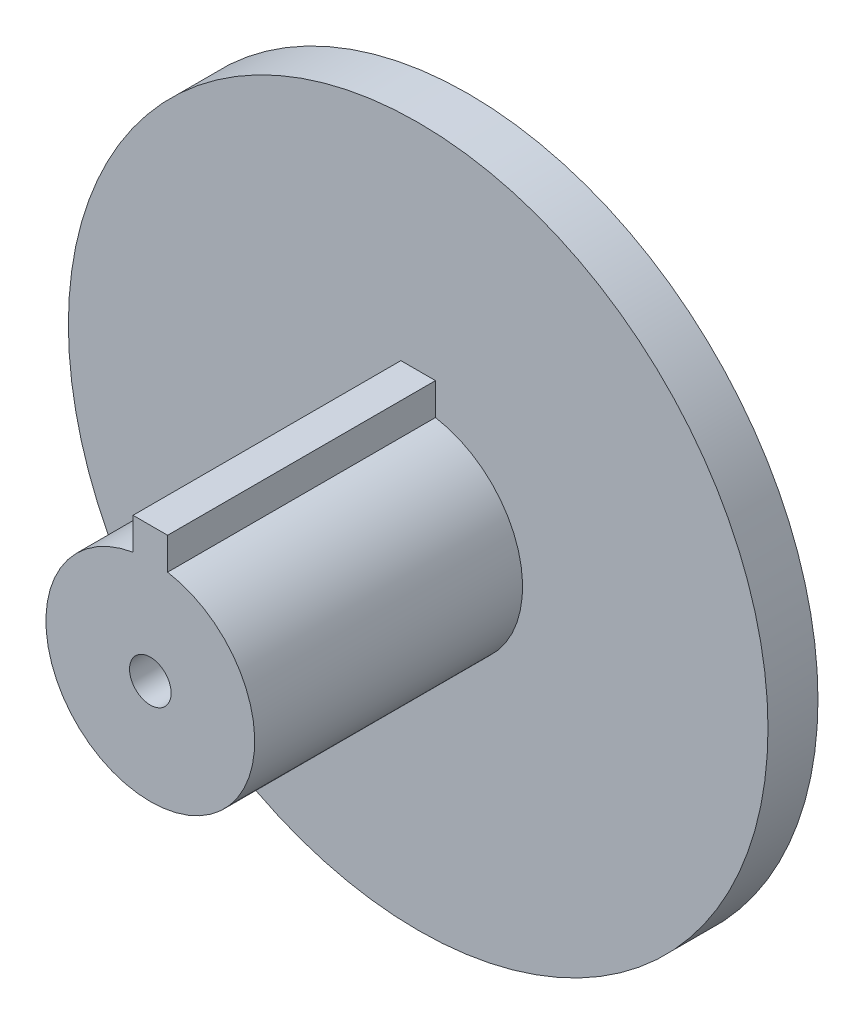
ISO-10303-21;
HEADER;
FILE_DESCRIPTION(('STEP AP214'),'2;1');
FILE_NAME('part.step','',(''),(''),'','','');
FILE_SCHEMA(('AUTOMOTIVE_DESIGN { 1 0 10303 214 1 1 1 1 }'));
ENDSEC;
DATA;
#1=APPLICATION_CONTEXT('core data for automotive mechanical design processes');
#2=APPLICATION_PROTOCOL_DEFINITION('international standard','automotive_design',2000,#1);
#3=PRODUCT_CONTEXT('',#1,'mechanical');
#4=PRODUCT('Part','Part','',(#3));
#5=PRODUCT_RELATED_PRODUCT_CATEGORY('part','',(#4));
#6=PRODUCT_DEFINITION_FORMATION('','',#4);
#7=PRODUCT_DEFINITION_CONTEXT('part definition',#1,'design');
#8=PRODUCT_DEFINITION('design','',#6,#7);
#9=PRODUCT_DEFINITION_SHAPE('','',#8);
#10=(LENGTH_UNIT() NAMED_UNIT(*) SI_UNIT(.MILLI.,.METRE.));
#11=(NAMED_UNIT(*) PLANE_ANGLE_UNIT() SI_UNIT($,.RADIAN.));
#12=(NAMED_UNIT(*) SI_UNIT($,.STERADIAN.) SOLID_ANGLE_UNIT());
#13=UNCERTAINTY_MEASURE_WITH_UNIT(LENGTH_MEASURE(1.E-05),#10,'distance_accuracy_value','');
#14=(GEOMETRIC_REPRESENTATION_CONTEXT(3) GLOBAL_UNCERTAINTY_ASSIGNED_CONTEXT((#13)) GLOBAL_UNIT_ASSIGNED_CONTEXT((#10,
#11,#12)) REPRESENTATION_CONTEXT('',''));
#15=CARTESIAN_POINT('',(0.,0.,0.));
#16=DIRECTION('',(0.,0.,1.));
#17=DIRECTION('',(1.,0.,0.));
#18=AXIS2_PLACEMENT_3D('',#15,#16,#17);
#19=CARTESIAN_POINT('',(0.,0.,6.35));
#20=DIRECTION('',(0.,0.,-1.));
#21=DIRECTION('',(-1.,0.,0.));
#22=AXIS2_PLACEMENT_3D('',#19,#20,#21);
#23=CYLINDRICAL_SURFACE('',#22,44.45);
#24=CARTESIAN_POINT('',(0.,0.,6.35));
#25=DIRECTION('',(0.,0.,1.));
#26=DIRECTION('',(1.,0.,0.));
#27=AXIS2_PLACEMENT_3D('',#24,#25,#26);
#28=CIRCLE('',#27,44.45);
#29=CARTESIAN_POINT('',(44.45,0.,6.35));
#30=VERTEX_POINT('',#29);
#31=EDGE_CURVE('E11',#30,#30,#28,.T.);
#32=ORIENTED_EDGE('',*,*,#31,.F.);
#33=EDGE_LOOP('',(#32));
#34=FACE_BOUND('',#33,.T.);
#35=CARTESIAN_POINT('',(0.,0.,0.));
#36=DIRECTION('',(0.,0.,1.));
#37=DIRECTION('',(1.,0.,0.));
#38=AXIS2_PLACEMENT_3D('',#35,#36,#37);
#39=CIRCLE('',#38,44.45);
#40=CARTESIAN_POINT('',(44.45,0.,0.));
#41=VERTEX_POINT('',#40);
#42=EDGE_CURVE('E44',#41,#41,#39,.T.);
#43=ORIENTED_EDGE('',*,*,#42,.T.);
#44=EDGE_LOOP('',(#43));
#45=FACE_BOUND('',#44,.T.);
#46=ADVANCED_FACE('F41',(#34,#45),#23,.T.);
#47=CARTESIAN_POINT('',(0.,0.,6.35));
#48=DIRECTION('',(0.,0.,1.));
#49=DIRECTION('',(1.,0.,0.));
#50=AXIS2_PLACEMENT_3D('',#47,#48,#49);
#51=PLANE('',#50);
#52=DIRECTION('',(0.,-1.,0.));
#53=VECTOR('',#52,1.);
#54=CARTESIAN_POINT('',(-2.1971,0.,6.35));
#55=LINE('',#54,#53);
#56=CARTESIAN_POINT('',(-2.1971,17.145,6.35));
#57=VERTEX_POINT('',#56);
#58=CARTESIAN_POINT('',(-2.1971,13.081,6.35));
#59=VERTEX_POINT('',#58);
#60=EDGE_CURVE('E56',#57,#59,#55,.T.);
#61=ORIENTED_EDGE('',*,*,#60,.F.);
#62=DIRECTION('',(1.,0.,0.));
#63=VECTOR('',#62,1.);
#64=CARTESIAN_POINT('',(0.,17.145,6.35));
#65=LINE('',#64,#63);
#66=CARTESIAN_POINT('',(2.1971,17.145,6.35));
#67=VERTEX_POINT('',#66);
#68=EDGE_CURVE('E61',#57,#67,#65,.T.);
#69=ORIENTED_EDGE('',*,*,#68,.T.);
#70=DIRECTION('',(0.,-1.,0.));
#71=VECTOR('',#70,1.);
#72=CARTESIAN_POINT('',(2.1971,0.,6.35));
#73=LINE('',#72,#71);
#74=CARTESIAN_POINT('',(2.1971,13.081,6.35));
#75=VERTEX_POINT('',#74);
#76=EDGE_CURVE('E120',#67,#75,#73,.T.);
#77=ORIENTED_EDGE('',*,*,#76,.T.);
#78=CARTESIAN_POINT('',(0.,0.,6.35));
#79=DIRECTION('',(0.,0.,1.));
#80=DIRECTION('',(1.,0.,0.));
#81=AXIS2_PLACEMENT_3D('',#78,#79,#80);
#82=CIRCLE('',#81,13.2642304492194);
#83=EDGE_CURVE('E123',#59,#75,#82,.T.);
#84=ORIENTED_EDGE('',*,*,#83,.F.);
#85=EDGE_LOOP('',(#61,#69,#77,#84));
#86=FACE_BOUND('',#85,.T.);
#87=ORIENTED_EDGE('',*,*,#31,.T.);
#88=EDGE_LOOP('',(#87));
#89=FACE_BOUND('',#88,.T.);
#90=ADVANCED_FACE('F151',(#86,#89),#51,.T.);
#91=CARTESIAN_POINT('',(0.,0.,0.));
#92=DIRECTION('',(0.,0.,1.));
#93=DIRECTION('',(1.,0.,0.));
#94=AXIS2_PLACEMENT_3D('',#91,#92,#93);
#95=PLANE('',#94);
#96=CARTESIAN_POINT('',(0.,0.,0.));
#97=DIRECTION('',(0.,0.,-1.));
#98=DIRECTION('',(-1.,0.,0.));
#99=AXIS2_PLACEMENT_3D('',#96,#97,#98);
#100=CIRCLE('',#99,2.6416);
#101=CARTESIAN_POINT('',(-2.6416,0.,0.));
#102=VERTEX_POINT('',#101);
#103=EDGE_CURVE('E133',#102,#102,#100,.T.);
#104=ORIENTED_EDGE('',*,*,#103,.F.);
#105=EDGE_LOOP('',(#104));
#106=FACE_BOUND('',#105,.T.);
#107=ORIENTED_EDGE('',*,*,#42,.F.);
#108=EDGE_LOOP('',(#107));
#109=FACE_BOUND('',#108,.T.);
#110=ADVANCED_FACE('F148',(#106,#109),#95,.F.);
#111=CARTESIAN_POINT('',(-2.1971,0.,40.386));
#112=DIRECTION('',(1.,0.,0.));
#113=DIRECTION('',(0.,1.,0.));
#114=AXIS2_PLACEMENT_3D('',#111,#112,#113);
#115=PLANE('',#114);
#116=ORIENTED_EDGE('',*,*,#60,.T.);
#117=DIRECTION('',(0.,0.,-1.));
#118=VECTOR('',#117,1.);
#119=CARTESIAN_POINT('',(-2.1971,13.081,40.386));
#120=LINE('',#119,#118);
#121=CARTESIAN_POINT('',(-2.1971,13.081,40.386));
#122=VERTEX_POINT('',#121);
#123=EDGE_CURVE('E86',#122,#59,#120,.T.);
#124=ORIENTED_EDGE('',*,*,#123,.F.);
#125=DIRECTION('',(0.,-1.,0.));
#126=VECTOR('',#125,1.);
#127=CARTESIAN_POINT('',(-2.1971,0.,40.386));
#128=LINE('',#127,#126);
#129=CARTESIAN_POINT('',(-2.1971,17.145,40.386));
#130=VERTEX_POINT('',#129);
#131=EDGE_CURVE('E94',#130,#122,#128,.T.);
#132=ORIENTED_EDGE('',*,*,#131,.F.);
#133=DIRECTION('',(0.,0.,-1.));
#134=VECTOR('',#133,1.);
#135=CARTESIAN_POINT('',(-2.1971,17.145,40.386));
#136=LINE('',#135,#134);
#137=EDGE_CURVE('E115',#130,#57,#136,.T.);
#138=ORIENTED_EDGE('',*,*,#137,.T.);
#139=EDGE_LOOP('',(#116,#124,#132,#138));
#140=FACE_BOUND('',#139,.T.);
#141=ADVANCED_FACE('F104',(#140),#115,.F.);
#142=CARTESIAN_POINT('',(0.,0.,40.386));
#143=DIRECTION('',(0.,0.,-1.));
#144=DIRECTION('',(-1.,0.,0.));
#145=AXIS2_PLACEMENT_3D('',#142,#143,#144);
#146=CYLINDRICAL_SURFACE('',#145,13.2642304492194);
#147=ORIENTED_EDGE('',*,*,#83,.T.);
#148=DIRECTION('',(0.,0.,-1.));
#149=VECTOR('',#148,1.);
#150=CARTESIAN_POINT('',(2.1971,13.081,40.386));
#151=LINE('',#150,#149);
#152=CARTESIAN_POINT('',(2.1971,13.081,40.386));
#153=VERTEX_POINT('',#152);
#154=EDGE_CURVE('E88',#153,#75,#151,.T.);
#155=ORIENTED_EDGE('',*,*,#154,.F.);
#156=CARTESIAN_POINT('',(0.,0.,40.386));
#157=DIRECTION('',(0.,0.,1.));
#158=DIRECTION('',(1.,0.,0.));
#159=AXIS2_PLACEMENT_3D('',#156,#157,#158);
#160=CIRCLE('',#159,13.2642304492194);
#161=EDGE_CURVE('E81',#122,#153,#160,.T.);
#162=ORIENTED_EDGE('',*,*,#161,.F.);
#163=ORIENTED_EDGE('',*,*,#123,.T.);
#164=EDGE_LOOP('',(#147,#155,#162,#163));
#165=FACE_BOUND('',#164,.T.);
#166=ADVANCED_FACE('F84',(#165),#146,.T.);
#167=CARTESIAN_POINT('',(2.1971,0.,40.386));
#168=DIRECTION('',(1.,0.,0.));
#169=DIRECTION('',(0.,1.,0.));
#170=AXIS2_PLACEMENT_3D('',#167,#168,#169);
#171=PLANE('',#170);
#172=ORIENTED_EDGE('',*,*,#76,.F.);
#173=DIRECTION('',(0.,0.,-1.));
#174=VECTOR('',#173,1.);
#175=CARTESIAN_POINT('',(2.1971,17.145,40.386));
#176=LINE('',#175,#174);
#177=CARTESIAN_POINT('',(2.1971,17.145,40.386));
#178=VERTEX_POINT('',#177);
#179=EDGE_CURVE('E110',#178,#67,#176,.T.);
#180=ORIENTED_EDGE('',*,*,#179,.F.);
#181=DIRECTION('',(0.,-1.,0.));
#182=VECTOR('',#181,1.);
#183=CARTESIAN_POINT('',(2.1971,0.,40.386));
#184=LINE('',#183,#182);
#185=EDGE_CURVE('E93',#178,#153,#184,.T.);
#186=ORIENTED_EDGE('',*,*,#185,.T.);
#187=ORIENTED_EDGE('',*,*,#154,.T.);
#188=EDGE_LOOP('',(#172,#180,#186,#187));
#189=FACE_BOUND('',#188,.T.);
#190=ADVANCED_FACE('F169',(#189),#171,.T.);
#191=CARTESIAN_POINT('',(0.,17.145,40.386));
#192=DIRECTION('',(0.,1.,0.));
#193=DIRECTION('',(0.,0.,1.));
#194=AXIS2_PLACEMENT_3D('',#191,#192,#193);
#195=PLANE('',#194);
#196=ORIENTED_EDGE('',*,*,#68,.F.);
#197=ORIENTED_EDGE('',*,*,#137,.F.);
#198=DIRECTION('',(1.,0.,0.));
#199=VECTOR('',#198,1.);
#200=CARTESIAN_POINT('',(0.,17.145,40.386));
#201=LINE('',#200,#199);
#202=EDGE_CURVE('E100',#130,#178,#201,.T.);
#203=ORIENTED_EDGE('',*,*,#202,.T.);
#204=ORIENTED_EDGE('',*,*,#179,.T.);
#205=EDGE_LOOP('',(#196,#197,#203,#204));
#206=FACE_BOUND('',#205,.T.);
#207=ADVANCED_FACE('F172',(#206),#195,.T.);
#208=CARTESIAN_POINT('',(0.,0.,40.386));
#209=DIRECTION('',(0.,0.,1.));
#210=DIRECTION('',(1.,0.,0.));
#211=AXIS2_PLACEMENT_3D('',#208,#209,#210);
#212=PLANE('',#211);
#213=CARTESIAN_POINT('',(0.,0.,40.386));
#214=DIRECTION('',(0.,0.,-1.));
#215=DIRECTION('',(-1.,0.,0.));
#216=AXIS2_PLACEMENT_3D('',#213,#214,#215);
#217=CIRCLE('',#216,2.6416);
#218=CARTESIAN_POINT('',(-2.6416,0.,40.386));
#219=VERTEX_POINT('',#218);
#220=EDGE_CURVE('E128',#219,#219,#217,.T.);
#221=ORIENTED_EDGE('',*,*,#220,.T.);
#222=EDGE_LOOP('',(#221));
#223=FACE_BOUND('',#222,.T.);
#224=ORIENTED_EDGE('',*,*,#131,.T.);
#225=ORIENTED_EDGE('',*,*,#161,.T.);
#226=ORIENTED_EDGE('',*,*,#185,.F.);
#227=ORIENTED_EDGE('',*,*,#202,.F.);
#228=EDGE_LOOP('',(#224,#225,#226,#227));
#229=FACE_BOUND('',#228,.T.);
#230=ADVANCED_FACE('F98',(#223,#229),#212,.T.);
#231=CARTESIAN_POINT('',(0.,0.,40.386));
#232=DIRECTION('',(0.,0.,-1.));
#233=DIRECTION('',(-1.,0.,0.));
#234=AXIS2_PLACEMENT_3D('',#231,#232,#233);
#235=CYLINDRICAL_SURFACE('',#234,2.6416);
#236=CARTESIAN_POINT('',(-2.6416,0.,40.386));
#237=CARTESIAN_POINT('',(-2.6416,0.,39.9653125));
#238=CARTESIAN_POINT('',(-2.6416,0.,39.544625));
#239=CARTESIAN_POINT('',(-2.6416,0.,38.70325));
#240=CARTESIAN_POINT('',(-2.6416,0.,38.2825625));
#241=CARTESIAN_POINT('',(-2.6416,0.,37.4411875));
#242=CARTESIAN_POINT('',(-2.6416,0.,37.0205));
#243=CARTESIAN_POINT('',(-2.6416,0.,36.179125));
#244=CARTESIAN_POINT('',(-2.6416,0.,35.7584375));
#245=CARTESIAN_POINT('',(-2.6416,0.,34.9170625));
#246=CARTESIAN_POINT('',(-2.6416,0.,34.496375));
#247=CARTESIAN_POINT('',(-2.6416,0.,33.655));
#248=CARTESIAN_POINT('',(-2.6416,0.,33.2343125));
#249=CARTESIAN_POINT('',(-2.6416,0.,32.3929375));
#250=CARTESIAN_POINT('',(-2.6416,0.,31.97225));
#251=CARTESIAN_POINT('',(-2.6416,0.,31.130875));
#252=CARTESIAN_POINT('',(-2.6416,0.,30.7101875));
#253=CARTESIAN_POINT('',(-2.6416,0.,29.8688125));
#254=CARTESIAN_POINT('',(-2.6416,0.,29.448125));
#255=CARTESIAN_POINT('',(-2.6416,0.,28.60675));
#256=CARTESIAN_POINT('',(-2.6416,0.,28.1860625));
#257=CARTESIAN_POINT('',(-2.6416,0.,27.3446875));
#258=CARTESIAN_POINT('',(-2.6416,0.,26.924));
#259=CARTESIAN_POINT('',(-2.6416,0.,26.082625));
#260=CARTESIAN_POINT('',(-2.6416,0.,25.6619375));
#261=CARTESIAN_POINT('',(-2.6416,0.,24.8205625));
#262=CARTESIAN_POINT('',(-2.6416,0.,24.399875));
#263=CARTESIAN_POINT('',(-2.6416,0.,23.5585));
#264=CARTESIAN_POINT('',(-2.6416,0.,23.1378125));
#265=CARTESIAN_POINT('',(-2.6416,0.,22.2964375));
#266=CARTESIAN_POINT('',(-2.6416,0.,21.87575));
#267=CARTESIAN_POINT('',(-2.6416,0.,21.034375));
#268=CARTESIAN_POINT('',(-2.6416,0.,20.6136875));
#269=CARTESIAN_POINT('',(-2.6416,0.,19.7723125));
#270=CARTESIAN_POINT('',(-2.6416,0.,19.351625));
#271=CARTESIAN_POINT('',(-2.6416,0.,18.51025));
#272=CARTESIAN_POINT('',(-2.6416,0.,18.0895625));
#273=CARTESIAN_POINT('',(-2.6416,0.,17.2481875));
#274=CARTESIAN_POINT('',(-2.6416,0.,16.8275));
#275=CARTESIAN_POINT('',(-2.6416,0.,15.986125));
#276=CARTESIAN_POINT('',(-2.6416,0.,15.5654375));
#277=CARTESIAN_POINT('',(-2.6416,0.,14.7240625));
#278=CARTESIAN_POINT('',(-2.6416,0.,14.303375));
#279=CARTESIAN_POINT('',(-2.6416,0.,13.462));
#280=CARTESIAN_POINT('',(-2.6416,0.,13.0413125));
#281=CARTESIAN_POINT('',(-2.6416,0.,12.1999375));
#282=CARTESIAN_POINT('',(-2.6416,0.,11.77925));
#283=CARTESIAN_POINT('',(-2.6416,0.,10.937875));
#284=CARTESIAN_POINT('',(-2.6416,0.,10.5171875));
#285=CARTESIAN_POINT('',(-2.6416,0.,9.67581250000001));
#286=CARTESIAN_POINT('',(-2.6416,0.,9.25512500000001));
#287=CARTESIAN_POINT('',(-2.6416,0.,8.41375000000001));
#288=CARTESIAN_POINT('',(-2.6416,0.,7.99306250000001));
#289=CARTESIAN_POINT('',(-2.6416,0.,7.15168750000001));
#290=CARTESIAN_POINT('',(-2.6416,0.,6.73100000000001));
#291=CARTESIAN_POINT('',(-2.6416,0.,5.88962500000001));
#292=CARTESIAN_POINT('',(-2.6416,0.,5.46893750000001));
#293=CARTESIAN_POINT('',(-2.6416,0.,4.62756250000001));
#294=CARTESIAN_POINT('',(-2.6416,0.,4.20687500000001));
#295=CARTESIAN_POINT('',(-2.6416,0.,3.36550000000001));
#296=CARTESIAN_POINT('',(-2.6416,0.,2.94481250000001));
#297=CARTESIAN_POINT('',(-2.6416,0.,2.10343750000001));
#298=CARTESIAN_POINT('',(-2.6416,0.,1.68275000000001));
#299=CARTESIAN_POINT('',(-2.6416,0.,0.841375000000008));
#300=CARTESIAN_POINT('',(-2.6416,0.,0.420687500000007));
#301=CARTESIAN_POINT('',(-2.6416,0.,0.));
#302=B_SPLINE_CURVE_WITH_KNOTS('',3,(#236,#237,#238,#239,#240,#241,#242,#243,#244,#245,#246,
#247,#248,#249,#250,#251,#252,#253,#254,#255,#256,#257,#258,#259,#260,#261,#262,#263,#264,#265,
#266,#267,#268,#269,#270,#271,#272,#273,#274,#275,#276,#277,#278,#279,#280,#281,#282,#283,#284,
#285,#286,#287,#288,#289,#290,#291,#292,#293,#294,#295,#296,#297,#298,#299,#300,#301),
.UNSPECIFIED.,.F.,.F.,(4,2,2,2,2,2,2,2,2,2,2,2,2,2,2,2,2,2,2,2,2,2,2,2,2,2,2,2,2,2,2,2,4),(0.,
1.26206249999999,2.524125,3.7861875,5.04825,6.3103125,7.572375,8.83443749999999,10.0965,
11.3585625,12.620625,13.8826875,15.14475,16.4068125,17.668875,18.9309375,20.193,21.4550625,
22.717125,23.9791875,25.24125,26.5033125,27.765375,29.0274375,30.2895,31.5515625,32.813625,
34.0756875,35.33775,36.5998125,37.861875,39.1239375,40.386),.UNSPECIFIED.);
#303=EDGE_CURVE('BSEAM142',#219,#102,#302,.T.);
#304=ORIENTED_EDGE('',*,*,#220,.F.);
#305=ORIENTED_EDGE('',*,*,#103,.T.);
#306=ORIENTED_EDGE('',*,*,#303,.T.);
#307=ORIENTED_EDGE('',*,*,#303,.F.);
#308=EDGE_LOOP('',(#304,#306,#305,#307));
#309=FACE_BOUND('',#308,.T.);
#310=ADVANCED_FACE('F142',(#309),#235,.F.);
#311=CLOSED_SHELL('',(#46,#90,#110,#141,#166,#190,#207,#230,#310));
#312=MANIFOLD_SOLID_BREP('B2',#311);
#313=ADVANCED_BREP_SHAPE_REPRESENTATION('',(#18,#312),#14);
#314=SHAPE_DEFINITION_REPRESENTATION(#9,#313);
ENDSEC;
END-ISO-10303-21;
